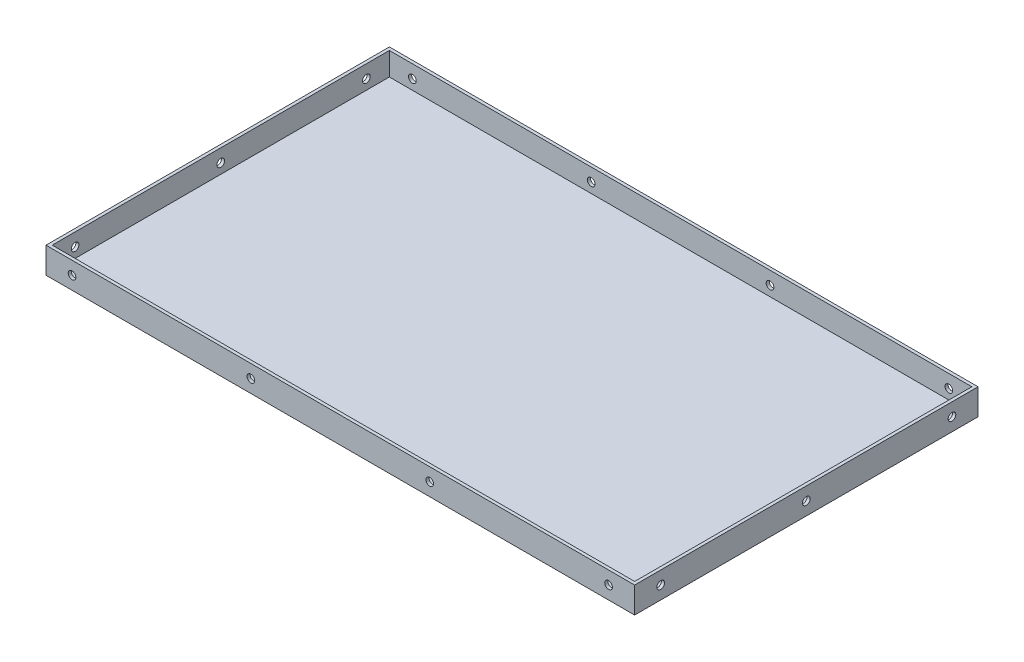
ISO-10303-21;
HEADER;
FILE_DESCRIPTION(('STEP AP214'),'2;1');
FILE_NAME('part.step','',(''),(''),'','','');
FILE_SCHEMA(('AUTOMOTIVE_DESIGN { 1 0 10303 214 1 1 1 1 }'));
ENDSEC;
DATA;
#1=APPLICATION_CONTEXT('core data for automotive mechanical design processes');
#2=APPLICATION_PROTOCOL_DEFINITION('international standard','automotive_design',2000,#1);
#3=PRODUCT_CONTEXT('',#1,'mechanical');
#4=PRODUCT('Part','Part','',(#3));
#5=PRODUCT_RELATED_PRODUCT_CATEGORY('part','',(#4));
#6=PRODUCT_DEFINITION_FORMATION('','',#4);
#7=PRODUCT_DEFINITION_CONTEXT('part definition',#1,'design');
#8=PRODUCT_DEFINITION('design','',#6,#7);
#9=PRODUCT_DEFINITION_SHAPE('','',#8);
#10=(LENGTH_UNIT() NAMED_UNIT(*) SI_UNIT(.MILLI.,.METRE.));
#11=(NAMED_UNIT(*) PLANE_ANGLE_UNIT() SI_UNIT($,.RADIAN.));
#12=(NAMED_UNIT(*) SI_UNIT($,.STERADIAN.) SOLID_ANGLE_UNIT());
#13=UNCERTAINTY_MEASURE_WITH_UNIT(LENGTH_MEASURE(1.E-05),#10,'distance_accuracy_value','');
#14=(GEOMETRIC_REPRESENTATION_CONTEXT(3) GLOBAL_UNCERTAINTY_ASSIGNED_CONTEXT((#13)) GLOBAL_UNIT_ASSIGNED_CONTEXT((#10,
#11,#12)) REPRESENTATION_CONTEXT('',''));
#15=CARTESIAN_POINT('',(0.,0.,0.));
#16=DIRECTION('',(0.,0.,1.));
#17=DIRECTION('',(1.,0.,0.));
#18=AXIS2_PLACEMENT_3D('',#15,#16,#17);
#19=CARTESIAN_POINT('',(-192.,2.,112.));
#20=DIRECTION('',(1.,0.,0.));
#21=DIRECTION('',(0.,0.,-1.));
#22=AXIS2_PLACEMENT_3D('',#19,#20,#21);
#23=PLANE('',#22);
#24=CARTESIAN_POINT('',(-192.,8.5,0.));
#25=DIRECTION('',(1.,0.,0.));
#26=DIRECTION('',(0.,0.,-1.));
#27=AXIS2_PLACEMENT_3D('',#24,#25,#26);
#28=CIRCLE('',#27,2.5);
#29=CARTESIAN_POINT('',(-192.,8.5,-2.50000000000005));
#30=VERTEX_POINT('',#29);
#31=EDGE_CURVE('E191',#30,#30,#28,.T.);
#32=ORIENTED_EDGE('',*,*,#31,.T.);
#33=EDGE_LOOP('',(#32));
#34=FACE_BOUND('',#33,.T.);
#35=CARTESIAN_POINT('',(-192.,8.5,-95.0000000000001));
#36=DIRECTION('',(1.,0.,0.));
#37=DIRECTION('',(0.,0.,-1.));
#38=AXIS2_PLACEMENT_3D('',#35,#36,#37);
#39=CIRCLE('',#38,2.5);
#40=CARTESIAN_POINT('',(-192.,8.5,-97.5000000000001));
#41=VERTEX_POINT('',#40);
#42=EDGE_CURVE('E202',#41,#41,#39,.T.);
#43=ORIENTED_EDGE('',*,*,#42,.T.);
#44=EDGE_LOOP('',(#43));
#45=FACE_BOUND('',#44,.T.);
#46=CARTESIAN_POINT('',(-192.,8.5,94.9999999999999));
#47=DIRECTION('',(1.,0.,0.));
#48=DIRECTION('',(0.,0.,-1.));
#49=AXIS2_PLACEMENT_3D('',#46,#47,#48);
#50=CIRCLE('',#49,2.5);
#51=CARTESIAN_POINT('',(-192.,8.5,92.4999999999999));
#52=VERTEX_POINT('',#51);
#53=EDGE_CURVE('E187',#52,#52,#50,.T.);
#54=ORIENTED_EDGE('',*,*,#53,.T.);
#55=EDGE_LOOP('',(#54));
#56=FACE_BOUND('',#55,.T.);
#57=DIRECTION('',(0.,0.,1.));
#58=VECTOR('',#57,1.);
#59=CARTESIAN_POINT('',(-192.,0.,112.));
#60=LINE('',#59,#58);
#61=CARTESIAN_POINT('',(-192.,0.,-112.));
#62=VERTEX_POINT('',#61);
#63=CARTESIAN_POINT('',(-192.,0.,112.));
#64=VERTEX_POINT('',#63);
#65=EDGE_CURVE('E150',#62,#64,#60,.T.);
#66=ORIENTED_EDGE('',*,*,#65,.T.);
#67=DIRECTION('',(0.,-1.,0.));
#68=VECTOR('',#67,1.);
#69=CARTESIAN_POINT('',(-192.,2.,112.));
#70=LINE('',#69,#68);
#71=CARTESIAN_POINT('',(-192.,17.,112.));
#72=VERTEX_POINT('',#71);
#73=EDGE_CURVE('E11',#72,#64,#70,.T.);
#74=ORIENTED_EDGE('',*,*,#73,.F.);
#75=DIRECTION('',(0.,0.,1.));
#76=VECTOR('',#75,1.);
#77=CARTESIAN_POINT('',(-192.,17.,-112.));
#78=LINE('',#77,#76);
#79=CARTESIAN_POINT('',(-192.,17.,-112.));
#80=VERTEX_POINT('',#79);
#81=EDGE_CURVE('E115',#80,#72,#78,.T.);
#82=ORIENTED_EDGE('',*,*,#81,.F.);
#83=DIRECTION('',(0.,-1.,0.));
#84=VECTOR('',#83,1.);
#85=CARTESIAN_POINT('',(-192.,2.,-112.));
#86=LINE('',#85,#84);
#87=EDGE_CURVE('E159',#80,#62,#86,.T.);
#88=ORIENTED_EDGE('',*,*,#87,.T.);
#89=EDGE_LOOP('',(#66,#74,#82,#88));
#90=FACE_BOUND('',#89,.T.);
#91=ADVANCED_FACE('F35',(#34,#45,#56,#90),#23,.F.);
#92=CARTESIAN_POINT('',(192.,2.,112.));
#93=DIRECTION('',(0.,0.,-1.));
#94=DIRECTION('',(-1.,0.,0.));
#95=AXIS2_PLACEMENT_3D('',#92,#93,#94);
#96=PLANE('',#95);
#97=CARTESIAN_POINT('',(58.3300000000001,8.5,112.));
#98=DIRECTION('',(0.,0.,-1.));
#99=DIRECTION('',(-1.,0.,0.));
#100=AXIS2_PLACEMENT_3D('',#97,#98,#99);
#101=CIRCLE('',#100,2.5);
#102=CARTESIAN_POINT('',(55.8300000000001,8.5,112.));
#103=VERTEX_POINT('',#102);
#104=EDGE_CURVE('E175',#103,#103,#101,.T.);
#105=ORIENTED_EDGE('',*,*,#104,.T.);
#106=EDGE_LOOP('',(#105));
#107=FACE_BOUND('',#106,.T.);
#108=CARTESIAN_POINT('',(-58.3399999999999,8.5,112.));
#109=DIRECTION('',(0.,0.,-1.));
#110=DIRECTION('',(-1.,0.,0.));
#111=AXIS2_PLACEMENT_3D('',#108,#109,#110);
#112=CIRCLE('',#111,2.5);
#113=CARTESIAN_POINT('',(-60.8399999999999,8.5,112.));
#114=VERTEX_POINT('',#113);
#115=EDGE_CURVE('E226',#114,#114,#112,.T.);
#116=ORIENTED_EDGE('',*,*,#115,.T.);
#117=EDGE_LOOP('',(#116));
#118=FACE_BOUND('',#117,.T.);
#119=CARTESIAN_POINT('',(-175.01,8.5,112.));
#120=DIRECTION('',(0.,0.,-1.));
#121=DIRECTION('',(-1.,0.,0.));
#122=AXIS2_PLACEMENT_3D('',#119,#120,#121);
#123=CIRCLE('',#122,2.5);
#124=CARTESIAN_POINT('',(-177.51,8.5,112.));
#125=VERTEX_POINT('',#124);
#126=EDGE_CURVE('E232',#125,#125,#123,.T.);
#127=ORIENTED_EDGE('',*,*,#126,.T.);
#128=EDGE_LOOP('',(#127));
#129=FACE_BOUND('',#128,.T.);
#130=CARTESIAN_POINT('',(175.,8.5,112.));
#131=DIRECTION('',(0.,0.,-1.));
#132=DIRECTION('',(-1.,0.,0.));
#133=AXIS2_PLACEMENT_3D('',#130,#131,#132);
#134=CIRCLE('',#133,2.5);
#135=CARTESIAN_POINT('',(172.5,8.5,112.));
#136=VERTEX_POINT('',#135);
#137=EDGE_CURVE('E170',#136,#136,#134,.T.);
#138=ORIENTED_EDGE('',*,*,#137,.T.);
#139=EDGE_LOOP('',(#138));
#140=FACE_BOUND('',#139,.T.);
#141=DIRECTION('',(1.,0.,0.));
#142=VECTOR('',#141,1.);
#143=CARTESIAN_POINT('',(192.,0.,112.));
#144=LINE('',#143,#142);
#145=CARTESIAN_POINT('',(192.,0.,112.));
#146=VERTEX_POINT('',#145);
#147=EDGE_CURVE('E153',#64,#146,#144,.T.);
#148=ORIENTED_EDGE('',*,*,#147,.T.);
#149=DIRECTION('',(0.,-1.,0.));
#150=VECTOR('',#149,1.);
#151=CARTESIAN_POINT('',(192.,2.,112.));
#152=LINE('',#151,#150);
#153=CARTESIAN_POINT('',(192.,17.,112.));
#154=VERTEX_POINT('',#153);
#155=EDGE_CURVE('E43',#154,#146,#152,.T.);
#156=ORIENTED_EDGE('',*,*,#155,.F.);
#157=DIRECTION('',(1.,0.,0.));
#158=VECTOR('',#157,1.);
#159=CARTESIAN_POINT('',(-192.,17.,112.));
#160=LINE('',#159,#158);
#161=EDGE_CURVE('E141',#72,#154,#160,.T.);
#162=ORIENTED_EDGE('',*,*,#161,.F.);
#163=ORIENTED_EDGE('',*,*,#73,.T.);
#164=EDGE_LOOP('',(#148,#156,#162,#163));
#165=FACE_BOUND('',#164,.T.);
#166=ADVANCED_FACE('F271',(#107,#118,#129,#140,#165),#96,.F.);
#167=CARTESIAN_POINT('',(192.,2.,112.));
#168=DIRECTION('',(-1.,0.,0.));
#169=DIRECTION('',(0.,0.,1.));
#170=AXIS2_PLACEMENT_3D('',#167,#168,#169);
#171=PLANE('',#170);
#172=CARTESIAN_POINT('',(192.,8.5,0.));
#173=DIRECTION('',(1.,0.,0.));
#174=DIRECTION('',(0.,0.,-1.));
#175=AXIS2_PLACEMENT_3D('',#172,#173,#174);
#176=CIRCLE('',#175,2.5);
#177=CARTESIAN_POINT('',(192.,8.5,-2.50000000000005));
#178=VERTEX_POINT('',#177);
#179=EDGE_CURVE('E197',#178,#178,#176,.T.);
#180=ORIENTED_EDGE('',*,*,#179,.F.);
#181=EDGE_LOOP('',(#180));
#182=FACE_BOUND('',#181,.T.);
#183=CARTESIAN_POINT('',(192.,8.5,-95.0000000000001));
#184=DIRECTION('',(1.,0.,0.));
#185=DIRECTION('',(0.,0.,-1.));
#186=AXIS2_PLACEMENT_3D('',#183,#184,#185);
#187=CIRCLE('',#186,2.5);
#188=CARTESIAN_POINT('',(192.,8.5,-97.5000000000001));
#189=VERTEX_POINT('',#188);
#190=EDGE_CURVE('E207',#189,#189,#187,.T.);
#191=ORIENTED_EDGE('',*,*,#190,.F.);
#192=EDGE_LOOP('',(#191));
#193=FACE_BOUND('',#192,.T.);
#194=CARTESIAN_POINT('',(192.,8.5,94.9999999999999));
#195=DIRECTION('',(1.,0.,0.));
#196=DIRECTION('',(0.,0.,-1.));
#197=AXIS2_PLACEMENT_3D('',#194,#195,#196);
#198=CIRCLE('',#197,2.5);
#199=CARTESIAN_POINT('',(192.,8.5,92.4999999999999));
#200=VERTEX_POINT('',#199);
#201=EDGE_CURVE('E213',#200,#200,#198,.T.);
#202=ORIENTED_EDGE('',*,*,#201,.F.);
#203=EDGE_LOOP('',(#202));
#204=FACE_BOUND('',#203,.T.);
#205=DIRECTION('',(0.,0.,-1.));
#206=VECTOR('',#205,1.);
#207=CARTESIAN_POINT('',(192.,0.,112.));
#208=LINE('',#207,#206);
#209=CARTESIAN_POINT('',(192.,0.,-112.));
#210=VERTEX_POINT('',#209);
#211=EDGE_CURVE('E155',#146,#210,#208,.T.);
#212=ORIENTED_EDGE('',*,*,#211,.T.);
#213=DIRECTION('',(0.,-1.,0.));
#214=VECTOR('',#213,1.);
#215=CARTESIAN_POINT('',(192.,2.,-112.));
#216=LINE('',#215,#214);
#217=CARTESIAN_POINT('',(192.,17.,-112.));
#218=VERTEX_POINT('',#217);
#219=EDGE_CURVE('E162',#218,#210,#216,.T.);
#220=ORIENTED_EDGE('',*,*,#219,.F.);
#221=DIRECTION('',(0.,0.,-1.));
#222=VECTOR('',#221,1.);
#223=CARTESIAN_POINT('',(192.,17.,-112.));
#224=LINE('',#223,#222);
#225=EDGE_CURVE('E144',#154,#218,#224,.T.);
#226=ORIENTED_EDGE('',*,*,#225,.F.);
#227=ORIENTED_EDGE('',*,*,#155,.T.);
#228=EDGE_LOOP('',(#212,#220,#226,#227));
#229=FACE_BOUND('',#228,.T.);
#230=ADVANCED_FACE('F277',(#182,#193,#204,#229),#171,.F.);
#231=CARTESIAN_POINT('',(192.,2.,-112.));
#232=DIRECTION('',(0.,0.,1.));
#233=DIRECTION('',(1.,0.,0.));
#234=AXIS2_PLACEMENT_3D('',#231,#232,#233);
#235=PLANE('',#234);
#236=CARTESIAN_POINT('',(58.33,8.5,-112.));
#237=DIRECTION('',(0.,0.,-1.));
#238=DIRECTION('',(-1.,0.,0.));
#239=AXIS2_PLACEMENT_3D('',#236,#237,#238);
#240=CIRCLE('',#239,2.5);
#241=CARTESIAN_POINT('',(55.83,8.5,-112.));
#242=VERTEX_POINT('',#241);
#243=EDGE_CURVE('E223',#242,#242,#240,.T.);
#244=ORIENTED_EDGE('',*,*,#243,.F.);
#245=EDGE_LOOP('',(#244));
#246=FACE_BOUND('',#245,.T.);
#247=CARTESIAN_POINT('',(-58.34,8.5,-112.));
#248=DIRECTION('',(0.,0.,-1.));
#249=DIRECTION('',(-1.,0.,0.));
#250=AXIS2_PLACEMENT_3D('',#247,#248,#249);
#251=CIRCLE('',#250,2.5);
#252=CARTESIAN_POINT('',(-60.84,8.5,-112.));
#253=VERTEX_POINT('',#252);
#254=EDGE_CURVE('E229',#253,#253,#251,.T.);
#255=ORIENTED_EDGE('',*,*,#254,.F.);
#256=EDGE_LOOP('',(#255));
#257=FACE_BOUND('',#256,.T.);
#258=CARTESIAN_POINT('',(-175.01,8.5,-112.));
#259=DIRECTION('',(0.,0.,-1.));
#260=DIRECTION('',(-1.,0.,0.));
#261=AXIS2_PLACEMENT_3D('',#258,#259,#260);
#262=CIRCLE('',#261,2.5);
#263=CARTESIAN_POINT('',(-177.51,8.5,-112.));
#264=VERTEX_POINT('',#263);
#265=EDGE_CURVE('E220',#264,#264,#262,.T.);
#266=ORIENTED_EDGE('',*,*,#265,.F.);
#267=EDGE_LOOP('',(#266));
#268=FACE_BOUND('',#267,.T.);
#269=CARTESIAN_POINT('',(175.,8.5,-112.));
#270=DIRECTION('',(0.,0.,-1.));
#271=DIRECTION('',(-1.,0.,0.));
#272=AXIS2_PLACEMENT_3D('',#269,#270,#271);
#273=CIRCLE('',#272,2.5);
#274=CARTESIAN_POINT('',(172.5,8.5,-112.));
#275=VERTEX_POINT('',#274);
#276=EDGE_CURVE('E243',#275,#275,#273,.T.);
#277=ORIENTED_EDGE('',*,*,#276,.F.);
#278=EDGE_LOOP('',(#277));
#279=FACE_BOUND('',#278,.T.);
#280=DIRECTION('',(-1.,0.,0.));
#281=VECTOR('',#280,1.);
#282=CARTESIAN_POINT('',(192.,0.,-112.));
#283=LINE('',#282,#281);
#284=EDGE_CURVE('E157',#210,#62,#283,.T.);
#285=ORIENTED_EDGE('',*,*,#284,.T.);
#286=ORIENTED_EDGE('',*,*,#87,.F.);
#287=DIRECTION('',(-1.,0.,0.));
#288=VECTOR('',#287,1.);
#289=CARTESIAN_POINT('',(-192.,17.,-112.));
#290=LINE('',#289,#288);
#291=EDGE_CURVE('E147',#218,#80,#290,.T.);
#292=ORIENTED_EDGE('',*,*,#291,.F.);
#293=ORIENTED_EDGE('',*,*,#219,.T.);
#294=EDGE_LOOP('',(#285,#286,#292,#293));
#295=FACE_BOUND('',#294,.T.);
#296=ADVANCED_FACE('F296',(#246,#257,#268,#279,#295),#235,.F.);
#297=CARTESIAN_POINT('',(0.,0.,0.));
#298=DIRECTION('',(0.,1.,0.));
#299=DIRECTION('',(0.,0.,1.));
#300=AXIS2_PLACEMENT_3D('',#297,#298,#299);
#301=PLANE('',#300);
#302=ORIENTED_EDGE('',*,*,#65,.F.);
#303=ORIENTED_EDGE('',*,*,#284,.F.);
#304=ORIENTED_EDGE('',*,*,#211,.F.);
#305=ORIENTED_EDGE('',*,*,#147,.F.);
#306=EDGE_LOOP('',(#302,#303,#304,#305));
#307=FACE_BOUND('',#306,.T.);
#308=ADVANCED_FACE('F289',(#307),#301,.F.);
#309=CARTESIAN_POINT('',(0.,17.,0.));
#310=DIRECTION('',(0.,1.,0.));
#311=DIRECTION('',(0.,0.,1.));
#312=AXIS2_PLACEMENT_3D('',#309,#310,#311);
#313=PLANE('',#312);
#314=ORIENTED_EDGE('',*,*,#81,.T.);
#315=ORIENTED_EDGE('',*,*,#161,.T.);
#316=ORIENTED_EDGE('',*,*,#225,.T.);
#317=ORIENTED_EDGE('',*,*,#291,.T.);
#318=EDGE_LOOP('',(#314,#315,#316,#317));
#319=FACE_BOUND('',#318,.T.);
#320=DIRECTION('',(1.,0.,0.));
#321=VECTOR('',#320,1.);
#322=CARTESIAN_POINT('',(-190.,17.,110.));
#323=LINE('',#322,#321);
#324=CARTESIAN_POINT('',(-190.,17.,110.));
#325=VERTEX_POINT('',#324);
#326=CARTESIAN_POINT('',(190.,17.,110.));
#327=VERTEX_POINT('',#326);
#328=EDGE_CURVE('E109',#325,#327,#323,.T.);
#329=ORIENTED_EDGE('',*,*,#328,.F.);
#330=DIRECTION('',(0.,0.,1.));
#331=VECTOR('',#330,1.);
#332=CARTESIAN_POINT('',(-190.,17.,-110.));
#333=LINE('',#332,#331);
#334=CARTESIAN_POINT('',(-190.,17.,-110.));
#335=VERTEX_POINT('',#334);
#336=EDGE_CURVE('E100',#335,#325,#333,.T.);
#337=ORIENTED_EDGE('',*,*,#336,.F.);
#338=DIRECTION('',(-1.,0.,0.));
#339=VECTOR('',#338,1.);
#340=CARTESIAN_POINT('',(-190.,17.,-110.));
#341=LINE('',#340,#339);
#342=CARTESIAN_POINT('',(190.,17.,-110.));
#343=VERTEX_POINT('',#342);
#344=EDGE_CURVE('E123',#343,#335,#341,.T.);
#345=ORIENTED_EDGE('',*,*,#344,.F.);
#346=DIRECTION('',(0.,0.,-1.));
#347=VECTOR('',#346,1.);
#348=CARTESIAN_POINT('',(190.,17.,-110.));
#349=LINE('',#348,#347);
#350=EDGE_CURVE('E121',#327,#343,#349,.T.);
#351=ORIENTED_EDGE('',*,*,#350,.F.);
#352=EDGE_LOOP('',(#329,#337,#345,#351));
#353=FACE_BOUND('',#352,.T.);
#354=ADVANCED_FACE('F119',(#319,#353),#313,.T.);
#355=CARTESIAN_POINT('',(-190.,17.,-110.));
#356=DIRECTION('',(1.,0.,0.));
#357=DIRECTION('',(0.,0.,-1.));
#358=AXIS2_PLACEMENT_3D('',#355,#356,#357);
#359=PLANE('',#358);
#360=CARTESIAN_POINT('',(-190.,8.5,0.));
#361=DIRECTION('',(1.,0.,0.));
#362=DIRECTION('',(0.,0.,-1.));
#363=AXIS2_PLACEMENT_3D('',#360,#361,#362);
#364=CIRCLE('',#363,2.5);
#365=CARTESIAN_POINT('',(-190.,8.5,-2.50000000000005));
#366=VERTEX_POINT('',#365);
#367=EDGE_CURVE('E210',#366,#366,#364,.T.);
#368=ORIENTED_EDGE('',*,*,#367,.F.);
#369=EDGE_LOOP('',(#368));
#370=FACE_BOUND('',#369,.T.);
#371=CARTESIAN_POINT('',(-190.,8.5,-95.0000000000001));
#372=DIRECTION('',(1.,0.,0.));
#373=DIRECTION('',(0.,0.,-1.));
#374=AXIS2_PLACEMENT_3D('',#371,#372,#373);
#375=CIRCLE('',#374,2.5);
#376=CARTESIAN_POINT('',(-190.,8.5,-97.5000000000001));
#377=VERTEX_POINT('',#376);
#378=EDGE_CURVE('E190',#377,#377,#375,.T.);
#379=ORIENTED_EDGE('',*,*,#378,.F.);
#380=EDGE_LOOP('',(#379));
#381=FACE_BOUND('',#380,.T.);
#382=CARTESIAN_POINT('',(-190.,8.5,94.9999999999999));
#383=DIRECTION('',(1.,0.,0.));
#384=DIRECTION('',(0.,0.,-1.));
#385=AXIS2_PLACEMENT_3D('',#382,#383,#384);
#386=CIRCLE('',#385,2.5);
#387=CARTESIAN_POINT('',(-190.,8.5,92.4999999999999));
#388=VERTEX_POINT('',#387);
#389=EDGE_CURVE('E186',#388,#388,#386,.T.);
#390=ORIENTED_EDGE('',*,*,#389,.F.);
#391=EDGE_LOOP('',(#390));
#392=FACE_BOUND('',#391,.T.);
#393=DIRECTION('',(0.,0.,1.));
#394=VECTOR('',#393,1.);
#395=CARTESIAN_POINT('',(-190.,2.,-110.));
#396=LINE('',#395,#394);
#397=CARTESIAN_POINT('',(-190.,2.,-110.));
#398=VERTEX_POINT('',#397);
#399=CARTESIAN_POINT('',(-190.,2.,110.));
#400=VERTEX_POINT('',#399);
#401=EDGE_CURVE('E51',#398,#400,#396,.T.);
#402=ORIENTED_EDGE('',*,*,#401,.F.);
#403=DIRECTION('',(0.,-1.,0.));
#404=VECTOR('',#403,1.);
#405=CARTESIAN_POINT('',(-190.,17.,-110.));
#406=LINE('',#405,#404);
#407=EDGE_CURVE('E105',#335,#398,#406,.T.);
#408=ORIENTED_EDGE('',*,*,#407,.F.);
#409=ORIENTED_EDGE('',*,*,#336,.T.);
#410=DIRECTION('',(0.,-1.,0.));
#411=VECTOR('',#410,1.);
#412=CARTESIAN_POINT('',(-190.,17.,110.));
#413=LINE('',#412,#411);
#414=EDGE_CURVE('E103',#325,#400,#413,.T.);
#415=ORIENTED_EDGE('',*,*,#414,.T.);
#416=EDGE_LOOP('',(#402,#408,#409,#415));
#417=FACE_BOUND('',#416,.T.);
#418=ADVANCED_FACE('F102',(#370,#381,#392,#417),#359,.T.);
#419=CARTESIAN_POINT('',(-190.,17.,110.));
#420=DIRECTION('',(0.,0.,-1.));
#421=DIRECTION('',(-1.,0.,0.));
#422=AXIS2_PLACEMENT_3D('',#419,#420,#421);
#423=PLANE('',#422);
#424=CARTESIAN_POINT('',(58.3300000000001,8.5,110.));
#425=DIRECTION('',(0.,0.,-1.));
#426=DIRECTION('',(-1.,0.,0.));
#427=AXIS2_PLACEMENT_3D('',#424,#425,#426);
#428=CIRCLE('',#427,2.5);
#429=CARTESIAN_POINT('',(55.8300000000001,8.5,110.));
#430=VERTEX_POINT('',#429);
#431=EDGE_CURVE('E183',#430,#430,#428,.T.);
#432=ORIENTED_EDGE('',*,*,#431,.F.);
#433=EDGE_LOOP('',(#432));
#434=FACE_BOUND('',#433,.T.);
#435=CARTESIAN_POINT('',(-58.3399999999999,8.5,110.));
#436=DIRECTION('',(0.,0.,-1.));
#437=DIRECTION('',(-1.,0.,0.));
#438=AXIS2_PLACEMENT_3D('',#435,#436,#437);
#439=CIRCLE('',#438,2.5);
#440=CARTESIAN_POINT('',(-60.8399999999999,8.5,110.));
#441=VERTEX_POINT('',#440);
#442=EDGE_CURVE('E179',#441,#441,#439,.T.);
#443=ORIENTED_EDGE('',*,*,#442,.F.);
#444=EDGE_LOOP('',(#443));
#445=FACE_BOUND('',#444,.T.);
#446=CARTESIAN_POINT('',(-175.01,8.5,110.));
#447=DIRECTION('',(0.,0.,-1.));
#448=DIRECTION('',(-1.,0.,0.));
#449=AXIS2_PLACEMENT_3D('',#446,#447,#448);
#450=CIRCLE('',#449,2.5);
#451=CARTESIAN_POINT('',(-177.51,8.5,110.));
#452=VERTEX_POINT('',#451);
#453=EDGE_CURVE('E174',#452,#452,#450,.T.);
#454=ORIENTED_EDGE('',*,*,#453,.F.);
#455=EDGE_LOOP('',(#454));
#456=FACE_BOUND('',#455,.T.);
#457=CARTESIAN_POINT('',(175.,8.5,110.));
#458=DIRECTION('',(0.,0.,-1.));
#459=DIRECTION('',(-1.,0.,0.));
#460=AXIS2_PLACEMENT_3D('',#457,#458,#459);
#461=CIRCLE('',#460,2.5);
#462=CARTESIAN_POINT('',(172.5,8.5,110.));
#463=VERTEX_POINT('',#462);
#464=EDGE_CURVE('E129',#463,#463,#461,.T.);
#465=ORIENTED_EDGE('',*,*,#464,.F.);
#466=EDGE_LOOP('',(#465));
#467=FACE_BOUND('',#466,.T.);
#468=DIRECTION('',(1.,0.,0.));
#469=VECTOR('',#468,1.);
#470=CARTESIAN_POINT('',(-190.,2.,110.));
#471=LINE('',#470,#469);
#472=CARTESIAN_POINT('',(190.,2.,110.));
#473=VERTEX_POINT('',#472);
#474=EDGE_CURVE('E55',#400,#473,#471,.T.);
#475=ORIENTED_EDGE('',*,*,#474,.F.);
#476=ORIENTED_EDGE('',*,*,#414,.F.);
#477=ORIENTED_EDGE('',*,*,#328,.T.);
#478=DIRECTION('',(0.,-1.,0.));
#479=VECTOR('',#478,1.);
#480=CARTESIAN_POINT('',(190.,17.,110.));
#481=LINE('',#480,#479);
#482=EDGE_CURVE('E116',#327,#473,#481,.T.);
#483=ORIENTED_EDGE('',*,*,#482,.T.);
#484=EDGE_LOOP('',(#475,#476,#477,#483));
#485=FACE_BOUND('',#484,.T.);
#486=ADVANCED_FACE('F113',(#434,#445,#456,#467,#485),#423,.T.);
#487=CARTESIAN_POINT('',(190.,17.,-110.));
#488=DIRECTION('',(-1.,0.,0.));
#489=DIRECTION('',(0.,0.,1.));
#490=AXIS2_PLACEMENT_3D('',#487,#488,#489);
#491=PLANE('',#490);
#492=CARTESIAN_POINT('',(190.,8.5,0.));
#493=DIRECTION('',(-1.,0.,0.));
#494=DIRECTION('',(0.,0.,1.));
#495=AXIS2_PLACEMENT_3D('',#492,#493,#494);
#496=CIRCLE('',#495,2.5);
#497=CARTESIAN_POINT('',(190.,8.5,2.49999999999994));
#498=VERTEX_POINT('',#497);
#499=EDGE_CURVE('E38',#498,#498,#496,.T.);
#500=ORIENTED_EDGE('',*,*,#499,.F.);
#501=EDGE_LOOP('',(#500));
#502=FACE_BOUND('',#501,.T.);
#503=CARTESIAN_POINT('',(190.,8.5,-95.0000000000001));
#504=DIRECTION('',(-1.,0.,0.));
#505=DIRECTION('',(0.,0.,1.));
#506=AXIS2_PLACEMENT_3D('',#503,#504,#505);
#507=CIRCLE('',#506,2.5);
#508=CARTESIAN_POINT('',(190.,8.5,-92.5000000000001));
#509=VERTEX_POINT('',#508);
#510=EDGE_CURVE('E188',#509,#509,#507,.T.);
#511=ORIENTED_EDGE('',*,*,#510,.F.);
#512=EDGE_LOOP('',(#511));
#513=FACE_BOUND('',#512,.T.);
#514=CARTESIAN_POINT('',(190.,8.5,94.9999999999999));
#515=DIRECTION('',(-1.,0.,0.));
#516=DIRECTION('',(0.,0.,1.));
#517=AXIS2_PLACEMENT_3D('',#514,#515,#516);
#518=CIRCLE('',#517,2.5);
#519=CARTESIAN_POINT('',(190.,8.5,97.4999999999999));
#520=VERTEX_POINT('',#519);
#521=EDGE_CURVE('E184',#520,#520,#518,.T.);
#522=ORIENTED_EDGE('',*,*,#521,.F.);
#523=EDGE_LOOP('',(#522));
#524=FACE_BOUND('',#523,.T.);
#525=DIRECTION('',(0.,0.,-1.));
#526=VECTOR('',#525,1.);
#527=CARTESIAN_POINT('',(190.,2.,-110.));
#528=LINE('',#527,#526);
#529=CARTESIAN_POINT('',(190.,2.,-110.));
#530=VERTEX_POINT('',#529);
#531=EDGE_CURVE('E131',#473,#530,#528,.T.);
#532=ORIENTED_EDGE('',*,*,#531,.F.);
#533=ORIENTED_EDGE('',*,*,#482,.F.);
#534=ORIENTED_EDGE('',*,*,#350,.T.);
#535=DIRECTION('',(0.,-1.,0.));
#536=VECTOR('',#535,1.);
#537=CARTESIAN_POINT('',(190.,17.,-110.));
#538=LINE('',#537,#536);
#539=EDGE_CURVE('E135',#343,#530,#538,.T.);
#540=ORIENTED_EDGE('',*,*,#539,.T.);
#541=EDGE_LOOP('',(#532,#533,#534,#540));
#542=FACE_BOUND('',#541,.T.);
#543=ADVANCED_FACE('F254',(#502,#513,#524,#542),#491,.T.);
#544=CARTESIAN_POINT('',(-190.,17.,-110.));
#545=DIRECTION('',(0.,0.,1.));
#546=DIRECTION('',(1.,0.,0.));
#547=AXIS2_PLACEMENT_3D('',#544,#545,#546);
#548=PLANE('',#547);
#549=CARTESIAN_POINT('',(58.33,8.5,-110.));
#550=DIRECTION('',(0.,0.,1.));
#551=DIRECTION('',(1.,0.,0.));
#552=AXIS2_PLACEMENT_3D('',#549,#550,#551);
#553=CIRCLE('',#552,2.5);
#554=CARTESIAN_POINT('',(60.83,8.5,-110.));
#555=VERTEX_POINT('',#554);
#556=EDGE_CURVE('E180',#555,#555,#553,.T.);
#557=ORIENTED_EDGE('',*,*,#556,.F.);
#558=EDGE_LOOP('',(#557));
#559=FACE_BOUND('',#558,.T.);
#560=CARTESIAN_POINT('',(-58.34,8.5,-110.));
#561=DIRECTION('',(0.,0.,1.));
#562=DIRECTION('',(1.,0.,0.));
#563=AXIS2_PLACEMENT_3D('',#560,#561,#562);
#564=CIRCLE('',#563,2.5);
#565=CARTESIAN_POINT('',(-55.84,8.5,-110.));
#566=VERTEX_POINT('',#565);
#567=EDGE_CURVE('E176',#566,#566,#564,.T.);
#568=ORIENTED_EDGE('',*,*,#567,.F.);
#569=EDGE_LOOP('',(#568));
#570=FACE_BOUND('',#569,.T.);
#571=CARTESIAN_POINT('',(-175.01,8.5,-110.));
#572=DIRECTION('',(0.,0.,1.));
#573=DIRECTION('',(1.,0.,0.));
#574=AXIS2_PLACEMENT_3D('',#571,#572,#573);
#575=CIRCLE('',#574,2.5);
#576=CARTESIAN_POINT('',(-172.51,8.5,-110.));
#577=VERTEX_POINT('',#576);
#578=EDGE_CURVE('E171',#577,#577,#575,.T.);
#579=ORIENTED_EDGE('',*,*,#578,.F.);
#580=EDGE_LOOP('',(#579));
#581=FACE_BOUND('',#580,.T.);
#582=CARTESIAN_POINT('',(175.,8.5,-110.));
#583=DIRECTION('',(0.,0.,1.));
#584=DIRECTION('',(1.,0.,0.));
#585=AXIS2_PLACEMENT_3D('',#582,#583,#584);
#586=CIRCLE('',#585,2.5);
#587=CARTESIAN_POINT('',(177.5,8.5,-110.));
#588=VERTEX_POINT('',#587);
#589=EDGE_CURVE('E167',#588,#588,#586,.T.);
#590=ORIENTED_EDGE('',*,*,#589,.F.);
#591=EDGE_LOOP('',(#590));
#592=FACE_BOUND('',#591,.T.);
#593=DIRECTION('',(-1.,0.,0.));
#594=VECTOR('',#593,1.);
#595=CARTESIAN_POINT('',(-190.,2.,-110.));
#596=LINE('',#595,#594);
#597=EDGE_CURVE('E110',#530,#398,#596,.T.);
#598=ORIENTED_EDGE('',*,*,#597,.F.);
#599=ORIENTED_EDGE('',*,*,#539,.F.);
#600=ORIENTED_EDGE('',*,*,#344,.T.);
#601=ORIENTED_EDGE('',*,*,#407,.T.);
#602=EDGE_LOOP('',(#598,#599,#600,#601));
#603=FACE_BOUND('',#602,.T.);
#604=ADVANCED_FACE('F262',(#559,#570,#581,#592,#603),#548,.T.);
#605=CARTESIAN_POINT('',(0.,2.,0.));
#606=DIRECTION('',(0.,1.,0.));
#607=DIRECTION('',(0.,0.,1.));
#608=AXIS2_PLACEMENT_3D('',#605,#606,#607);
#609=PLANE('',#608);
#610=ORIENTED_EDGE('',*,*,#401,.T.);
#611=ORIENTED_EDGE('',*,*,#474,.T.);
#612=ORIENTED_EDGE('',*,*,#531,.T.);
#613=ORIENTED_EDGE('',*,*,#597,.T.);
#614=EDGE_LOOP('',(#610,#611,#612,#613));
#615=FACE_BOUND('',#614,.T.);
#616=ADVANCED_FACE('F309',(#615),#609,.T.);
#617=CARTESIAN_POINT('',(175.,8.5,112.));
#618=DIRECTION('',(0.,0.,-1.));
#619=DIRECTION('',(-1.,0.,0.));
#620=AXIS2_PLACEMENT_3D('',#617,#618,#619);
#621=CYLINDRICAL_SURFACE('',#620,2.5);
#622=ORIENTED_EDGE('',*,*,#589,.T.);
#623=EDGE_LOOP('',(#622));
#624=FACE_BOUND('',#623,.T.);
#625=ORIENTED_EDGE('',*,*,#276,.T.);
#626=EDGE_LOOP('',(#625));
#627=FACE_BOUND('',#626,.T.);
#628=ADVANCED_FACE('F312',(#624,#627),#621,.F.);
#629=ORIENTED_EDGE('',*,*,#464,.T.);
#630=EDGE_LOOP('',(#629));
#631=FACE_BOUND('',#630,.T.);
#632=ORIENTED_EDGE('',*,*,#137,.F.);
#633=EDGE_LOOP('',(#632));
#634=FACE_BOUND('',#633,.T.);
#635=ADVANCED_FACE('F250',(#631,#634),#621,.F.);
#636=CARTESIAN_POINT('',(-175.01,8.5,112.));
#637=DIRECTION('',(0.,0.,-1.));
#638=DIRECTION('',(-1.,0.,0.));
#639=AXIS2_PLACEMENT_3D('',#636,#637,#638);
#640=CYLINDRICAL_SURFACE('',#639,2.5);
#641=ORIENTED_EDGE('',*,*,#578,.T.);
#642=EDGE_LOOP('',(#641));
#643=FACE_BOUND('',#642,.T.);
#644=ORIENTED_EDGE('',*,*,#265,.T.);
#645=EDGE_LOOP('',(#644));
#646=FACE_BOUND('',#645,.T.);
#647=ADVANCED_FACE('F361',(#643,#646),#640,.F.);
#648=CARTESIAN_POINT('',(-58.3399999999999,8.5,112.));
#649=DIRECTION('',(0.,0.,-1.));
#650=DIRECTION('',(-1.,0.,0.));
#651=AXIS2_PLACEMENT_3D('',#648,#649,#650);
#652=CYLINDRICAL_SURFACE('',#651,2.5);
#653=ORIENTED_EDGE('',*,*,#567,.T.);
#654=EDGE_LOOP('',(#653));
#655=FACE_BOUND('',#654,.T.);
#656=ORIENTED_EDGE('',*,*,#254,.T.);
#657=EDGE_LOOP('',(#656));
#658=FACE_BOUND('',#657,.T.);
#659=ADVANCED_FACE('F367',(#655,#658),#652,.F.);
#660=CARTESIAN_POINT('',(58.3300000000001,8.5,112.));
#661=DIRECTION('',(0.,0.,-1.));
#662=DIRECTION('',(-1.,0.,0.));
#663=AXIS2_PLACEMENT_3D('',#660,#661,#662);
#664=CYLINDRICAL_SURFACE('',#663,2.5);
#665=ORIENTED_EDGE('',*,*,#556,.T.);
#666=EDGE_LOOP('',(#665));
#667=FACE_BOUND('',#666,.T.);
#668=ORIENTED_EDGE('',*,*,#243,.T.);
#669=EDGE_LOOP('',(#668));
#670=FACE_BOUND('',#669,.T.);
#671=ADVANCED_FACE('F376',(#667,#670),#664,.F.);
#672=ORIENTED_EDGE('',*,*,#453,.T.);
#673=EDGE_LOOP('',(#672));
#674=FACE_BOUND('',#673,.T.);
#675=ORIENTED_EDGE('',*,*,#126,.F.);
#676=EDGE_LOOP('',(#675));
#677=FACE_BOUND('',#676,.T.);
#678=ADVANCED_FACE('F370',(#674,#677),#640,.F.);
#679=ORIENTED_EDGE('',*,*,#442,.T.);
#680=EDGE_LOOP('',(#679));
#681=FACE_BOUND('',#680,.T.);
#682=ORIENTED_EDGE('',*,*,#115,.F.);
#683=EDGE_LOOP('',(#682));
#684=FACE_BOUND('',#683,.T.);
#685=ADVANCED_FACE('F379',(#681,#684),#652,.F.);
#686=ORIENTED_EDGE('',*,*,#431,.T.);
#687=EDGE_LOOP('',(#686));
#688=FACE_BOUND('',#687,.T.);
#689=ORIENTED_EDGE('',*,*,#104,.F.);
#690=EDGE_LOOP('',(#689));
#691=FACE_BOUND('',#690,.T.);
#692=ADVANCED_FACE('F387',(#688,#691),#664,.F.);
#693=CARTESIAN_POINT('',(-192.,8.5,94.9999999999999));
#694=DIRECTION('',(1.,0.,0.));
#695=DIRECTION('',(0.,0.,-1.));
#696=AXIS2_PLACEMENT_3D('',#693,#694,#695);
#697=CYLINDRICAL_SURFACE('',#696,2.5);
#698=ORIENTED_EDGE('',*,*,#521,.T.);
#699=EDGE_LOOP('',(#698));
#700=FACE_BOUND('',#699,.T.);
#701=ORIENTED_EDGE('',*,*,#201,.T.);
#702=EDGE_LOOP('',(#701));
#703=FACE_BOUND('',#702,.T.);
#704=ADVANCED_FACE('F404',(#700,#703),#697,.F.);
#705=ORIENTED_EDGE('',*,*,#389,.T.);
#706=EDGE_LOOP('',(#705));
#707=FACE_BOUND('',#706,.T.);
#708=ORIENTED_EDGE('',*,*,#53,.F.);
#709=EDGE_LOOP('',(#708));
#710=FACE_BOUND('',#709,.T.);
#711=ADVANCED_FACE('F410',(#707,#710),#697,.F.);
#712=CARTESIAN_POINT('',(-192.,8.5,-95.0000000000001));
#713=DIRECTION('',(1.,0.,0.));
#714=DIRECTION('',(0.,0.,-1.));
#715=AXIS2_PLACEMENT_3D('',#712,#713,#714);
#716=CYLINDRICAL_SURFACE('',#715,2.5);
#717=ORIENTED_EDGE('',*,*,#510,.T.);
#718=EDGE_LOOP('',(#717));
#719=FACE_BOUND('',#718,.T.);
#720=ORIENTED_EDGE('',*,*,#190,.T.);
#721=EDGE_LOOP('',(#720));
#722=FACE_BOUND('',#721,.T.);
#723=ADVANCED_FACE('F418',(#719,#722),#716,.F.);
#724=CARTESIAN_POINT('',(-192.,8.5,0.));
#725=DIRECTION('',(1.,0.,0.));
#726=DIRECTION('',(0.,0.,-1.));
#727=AXIS2_PLACEMENT_3D('',#724,#725,#726);
#728=CYLINDRICAL_SURFACE('',#727,2.5);
#729=ORIENTED_EDGE('',*,*,#499,.T.);
#730=EDGE_LOOP('',(#729));
#731=FACE_BOUND('',#730,.T.);
#732=ORIENTED_EDGE('',*,*,#179,.T.);
#733=EDGE_LOOP('',(#732));
#734=FACE_BOUND('',#733,.T.);
#735=ADVANCED_FACE('F425',(#731,#734),#728,.F.);
#736=ORIENTED_EDGE('',*,*,#378,.T.);
#737=EDGE_LOOP('',(#736));
#738=FACE_BOUND('',#737,.T.);
#739=ORIENTED_EDGE('',*,*,#42,.F.);
#740=EDGE_LOOP('',(#739));
#741=FACE_BOUND('',#740,.T.);
#742=ADVANCED_FACE('F427',(#738,#741),#716,.F.);
#743=ORIENTED_EDGE('',*,*,#367,.T.);
#744=EDGE_LOOP('',(#743));
#745=FACE_BOUND('',#744,.T.);
#746=ORIENTED_EDGE('',*,*,#31,.F.);
#747=EDGE_LOOP('',(#746));
#748=FACE_BOUND('',#747,.T.);
#749=ADVANCED_FACE('F435',(#745,#748),#728,.F.);
#750=CLOSED_SHELL('',(#91,#166,#230,#296,#308,#354,#418,#486,#543,#604,#616,#628,#635,#647,#659,
#671,#678,#685,#692,#704,#711,#723,#735,#742,#749));
#751=MANIFOLD_SOLID_BREP('B2',#750);
#752=ADVANCED_BREP_SHAPE_REPRESENTATION('',(#18,#751),#14);
#753=SHAPE_DEFINITION_REPRESENTATION(#9,#752);
ENDSEC;
END-ISO-10303-21;
